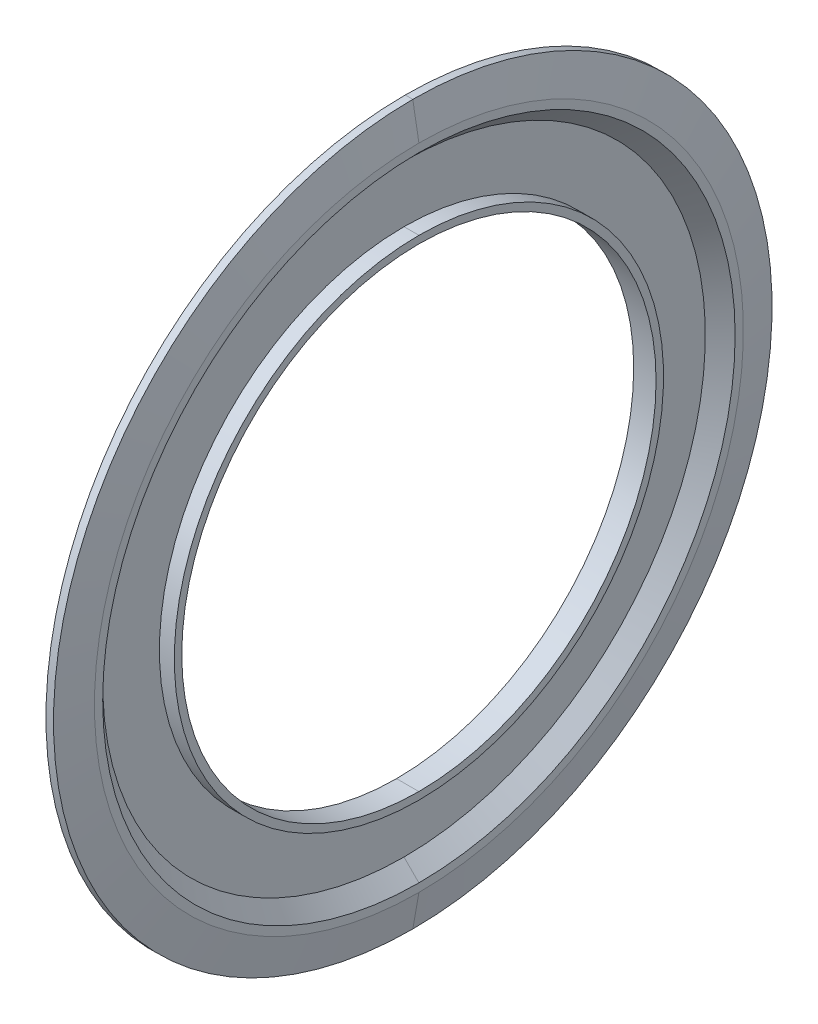
ISO-10303-21;
HEADER;
FILE_DESCRIPTION(('STEP AP214'),'2;1');
FILE_NAME('part.step','',(''),(''),'','','');
FILE_SCHEMA(('AUTOMOTIVE_DESIGN { 1 0 10303 214 1 1 1 1 }'));
ENDSEC;
DATA;
#1=APPLICATION_CONTEXT('core data for automotive mechanical design processes');
#2=APPLICATION_PROTOCOL_DEFINITION('international standard','automotive_design',2000,#1);
#3=PRODUCT_CONTEXT('',#1,'mechanical');
#4=PRODUCT('Part','Part','',(#3));
#5=PRODUCT_RELATED_PRODUCT_CATEGORY('part','',(#4));
#6=PRODUCT_DEFINITION_FORMATION('','',#4);
#7=PRODUCT_DEFINITION_CONTEXT('part definition',#1,'design');
#8=PRODUCT_DEFINITION('design','',#6,#7);
#9=PRODUCT_DEFINITION_SHAPE('','',#8);
#10=(LENGTH_UNIT() NAMED_UNIT(*) SI_UNIT(.MILLI.,.METRE.));
#11=(NAMED_UNIT(*) PLANE_ANGLE_UNIT() SI_UNIT($,.RADIAN.));
#12=(NAMED_UNIT(*) SI_UNIT($,.STERADIAN.) SOLID_ANGLE_UNIT());
#13=UNCERTAINTY_MEASURE_WITH_UNIT(LENGTH_MEASURE(1.E-05),#10,'distance_accuracy_value','');
#14=(GEOMETRIC_REPRESENTATION_CONTEXT(3) GLOBAL_UNCERTAINTY_ASSIGNED_CONTEXT((#13)) GLOBAL_UNIT_ASSIGNED_CONTEXT((#10,
#11,#12)) REPRESENTATION_CONTEXT('',''));
#15=CARTESIAN_POINT('',(0.,0.,0.));
#16=DIRECTION('',(0.,0.,1.));
#17=DIRECTION('',(1.,0.,0.));
#18=AXIS2_PLACEMENT_3D('',#15,#16,#17);
#19=CARTESIAN_POINT('',(0.727661870153498,7.996725,0.));
#20=DIRECTION('',(1.,0.,0.));
#21=DIRECTION('',(0.,0.,1.));
#22=AXIS2_PLACEMENT_3D('',#19,#20,#21);
#23=PLANE('',#22);
#24=CARTESIAN_POINT('',(0.727661870153498,0.,0.));
#25=DIRECTION('',(-1.,0.,0.));
#26=DIRECTION('',(0.,1.,0.));
#27=AXIS2_PLACEMENT_3D('',#24,#25,#26);
#28=CIRCLE('',#27,7.89345);
#29=CARTESIAN_POINT('',(0.727661870153498,7.89345,0.));
#30=VERTEX_POINT('',#29);
#31=CARTESIAN_POINT('',(0.727661870153498,-7.89345,0.));
#32=VERTEX_POINT('',#31);
#33=EDGE_CURVE('E11',#30,#32,#28,.T.);
#34=ORIENTED_EDGE('',*,*,#33,.T.);
#35=CARTESIAN_POINT('',(0.727661870153498,0.,0.));
#36=DIRECTION('',(-1.,0.,0.));
#37=DIRECTION('',(0.,1.,0.));
#38=AXIS2_PLACEMENT_3D('',#35,#36,#37);
#39=CIRCLE('',#38,7.89345);
#40=EDGE_CURVE('E110',#32,#30,#39,.T.);
#41=ORIENTED_EDGE('',*,*,#40,.T.);
#42=EDGE_LOOP('',(#34,#41));
#43=FACE_BOUND('',#42,.T.);
#44=CARTESIAN_POINT('',(0.727661870153498,0.,0.));
#45=DIRECTION('',(-1.,0.,0.));
#46=DIRECTION('',(0.,1.,0.));
#47=AXIS2_PLACEMENT_3D('',#44,#45,#46);
#48=CIRCLE('',#47,8.1);
#49=CARTESIAN_POINT('',(0.727661870153498,8.1,0.));
#50=VERTEX_POINT('',#49);
#51=CARTESIAN_POINT('',(0.727661870153498,-8.1,0.));
#52=VERTEX_POINT('',#51);
#53=EDGE_CURVE('E186',#50,#52,#48,.T.);
#54=ORIENTED_EDGE('',*,*,#53,.F.);
#55=CARTESIAN_POINT('',(0.727661870153498,0.,0.));
#56=DIRECTION('',(-1.,0.,0.));
#57=DIRECTION('',(0.,1.,0.));
#58=AXIS2_PLACEMENT_3D('',#55,#56,#57);
#59=CIRCLE('',#58,8.1);
#60=EDGE_CURVE('E30',#52,#50,#59,.T.);
#61=ORIENTED_EDGE('',*,*,#60,.F.);
#62=EDGE_LOOP('',(#54,#61));
#63=FACE_BOUND('',#62,.T.);
#64=ADVANCED_FACE('F17',(#43,#63),#23,.T.);
#65=CARTESIAN_POINT('',(0.541661870153498,0.,0.));
#66=DIRECTION('',(1.,0.,0.));
#67=DIRECTION('',(0.,1.,0.));
#68=AXIS2_PLACEMENT_3D('',#65,#66,#67);
#69=CONICAL_SURFACE('',#68,7.70745,0.785398163397448);
#70=DIRECTION('',(-0.707106781186548,-0.707106781186547,0.));
#71=VECTOR('',#70,1.);
#72=CARTESIAN_POINT('',(0.541661870153498,7.70745,0.));
#73=LINE('',#72,#71);
#74=CARTESIAN_POINT('',(0.355661870153497,7.52145,0.));
#75=VERTEX_POINT('',#74);
#76=EDGE_CURVE('E105',#30,#75,#73,.T.);
#77=ORIENTED_EDGE('',*,*,#76,.T.);
#78=CARTESIAN_POINT('',(0.355661870153497,0.,0.));
#79=DIRECTION('',(-1.,0.,0.));
#80=DIRECTION('',(0.,1.,0.));
#81=AXIS2_PLACEMENT_3D('',#78,#79,#80);
#82=CIRCLE('',#81,7.52145);
#83=CARTESIAN_POINT('',(0.355661870153497,-7.52145,0.));
#84=VERTEX_POINT('',#83);
#85=EDGE_CURVE('E24',#75,#84,#82,.T.);
#86=ORIENTED_EDGE('',*,*,#85,.T.);
#87=DIRECTION('',(0.707106781186548,-0.707106781186547,0.));
#88=VECTOR('',#87,1.);
#89=CARTESIAN_POINT('',(0.541661870153498,-7.70745,0.));
#90=LINE('',#89,#88);
#91=EDGE_CURVE('E107',#84,#32,#90,.T.);
#92=ORIENTED_EDGE('',*,*,#91,.T.);
#93=ORIENTED_EDGE('',*,*,#33,.F.);
#94=EDGE_LOOP('',(#77,#86,#92,#93));
#95=FACE_BOUND('',#94,.T.);
#96=ADVANCED_FACE('F103',(#95),#69,.F.);
#97=CARTESIAN_POINT('',(0.355661870153497,6.8136,0.));
#98=DIRECTION('',(1.,0.,0.));
#99=DIRECTION('',(0.,-1.,0.));
#100=AXIS2_PLACEMENT_3D('',#97,#98,#99);
#101=PLANE('',#100);
#102=CARTESIAN_POINT('',(0.355661870153497,0.,0.));
#103=DIRECTION('',(-1.,0.,0.));
#104=DIRECTION('',(0.,1.,0.));
#105=AXIS2_PLACEMENT_3D('',#102,#103,#104);
#106=CIRCLE('',#105,6.10575);
#107=CARTESIAN_POINT('',(0.355661870153497,6.10575,0.));
#108=VERTEX_POINT('',#107);
#109=CARTESIAN_POINT('',(0.355661870153497,-6.10575,0.));
#110=VERTEX_POINT('',#109);
#111=EDGE_CURVE('E147',#108,#110,#106,.T.);
#112=ORIENTED_EDGE('',*,*,#111,.T.);
#113=CARTESIAN_POINT('',(0.355661870153497,0.,0.));
#114=DIRECTION('',(-1.,0.,0.));
#115=DIRECTION('',(0.,1.,0.));
#116=AXIS2_PLACEMENT_3D('',#113,#114,#115);
#117=CIRCLE('',#116,6.10575);
#118=EDGE_CURVE('E202',#110,#108,#117,.T.);
#119=ORIENTED_EDGE('',*,*,#118,.T.);
#120=EDGE_LOOP('',(#112,#119));
#121=FACE_BOUND('',#120,.T.);
#122=ORIENTED_EDGE('',*,*,#85,.F.);
#123=CARTESIAN_POINT('',(0.355661870153497,0.,0.));
#124=DIRECTION('',(-1.,0.,0.));
#125=DIRECTION('',(0.,1.,0.));
#126=AXIS2_PLACEMENT_3D('',#123,#124,#125);
#127=CIRCLE('',#126,7.52145);
#128=EDGE_CURVE('E116',#84,#75,#127,.T.);
#129=ORIENTED_EDGE('',*,*,#128,.F.);
#130=EDGE_LOOP('',(#122,#129));
#131=FACE_BOUND('',#130,.T.);
#132=ADVANCED_FACE('F204',(#121,#131),#101,.T.);
#133=CARTESIAN_POINT('',(0.541661870153498,0.,0.));
#134=DIRECTION('',(-1.,0.,0.));
#135=DIRECTION('',(0.,1.,0.));
#136=AXIS2_PLACEMENT_3D('',#133,#134,#135);
#137=CYLINDRICAL_SURFACE('',#136,6.10575);
#138=DIRECTION('',(-1.,0.,0.));
#139=VECTOR('',#138,1.);
#140=CARTESIAN_POINT('',(0.541661870153498,6.10575,0.));
#141=LINE('',#140,#139);
#142=CARTESIAN_POINT('',(0.727661870153498,6.10575,0.));
#143=VERTEX_POINT('',#142);
#144=EDGE_CURVE('E133',#143,#108,#141,.T.);
#145=ORIENTED_EDGE('',*,*,#144,.T.);
#146=ORIENTED_EDGE('',*,*,#118,.F.);
#147=DIRECTION('',(1.,0.,0.));
#148=VECTOR('',#147,1.);
#149=CARTESIAN_POINT('',(0.541661870153498,-6.10575,0.));
#150=LINE('',#149,#148);
#151=CARTESIAN_POINT('',(0.727661870153498,-6.10575,0.));
#152=VERTEX_POINT('',#151);
#153=EDGE_CURVE('E139',#110,#152,#150,.T.);
#154=ORIENTED_EDGE('',*,*,#153,.T.);
#155=CARTESIAN_POINT('',(0.727661870153498,0.,0.));
#156=DIRECTION('',(-1.,0.,0.));
#157=DIRECTION('',(0.,1.,0.));
#158=AXIS2_PLACEMENT_3D('',#155,#156,#157);
#159=CIRCLE('',#158,6.10575);
#160=EDGE_CURVE('E200',#152,#143,#159,.T.);
#161=ORIENTED_EDGE('',*,*,#160,.T.);
#162=EDGE_LOOP('',(#145,#146,#154,#161));
#163=FACE_BOUND('',#162,.T.);
#164=ADVANCED_FACE('F206',(#163),#137,.T.);
#165=CARTESIAN_POINT('',(0.727661870153498,6.01275,0.));
#166=DIRECTION('',(1.,0.,0.));
#167=DIRECTION('',(0.,0.,1.));
#168=AXIS2_PLACEMENT_3D('',#165,#166,#167);
#169=PLANE('',#168);
#170=CARTESIAN_POINT('',(0.727661870153498,0.,0.));
#171=DIRECTION('',(-1.,0.,0.));
#172=DIRECTION('',(0.,1.,0.));
#173=AXIS2_PLACEMENT_3D('',#170,#171,#172);
#174=CIRCLE('',#173,5.91975);
#175=CARTESIAN_POINT('',(0.727661870153498,5.91975,0.));
#176=VERTEX_POINT('',#175);
#177=CARTESIAN_POINT('',(0.727661870153498,-5.91975,0.));
#178=VERTEX_POINT('',#177);
#179=EDGE_CURVE('E198',#176,#178,#174,.T.);
#180=ORIENTED_EDGE('',*,*,#179,.T.);
#181=CARTESIAN_POINT('',(0.727661870153498,0.,0.));
#182=DIRECTION('',(-1.,0.,0.));
#183=DIRECTION('',(0.,1.,0.));
#184=AXIS2_PLACEMENT_3D('',#181,#182,#183);
#185=CIRCLE('',#184,5.91975);
#186=EDGE_CURVE('E123',#178,#176,#185,.T.);
#187=ORIENTED_EDGE('',*,*,#186,.T.);
#188=EDGE_LOOP('',(#180,#187));
#189=FACE_BOUND('',#188,.T.);
#190=CARTESIAN_POINT('',(0.727661870153498,0.,0.));
#191=DIRECTION('',(-1.,0.,0.));
#192=DIRECTION('',(0.,1.,0.));
#193=AXIS2_PLACEMENT_3D('',#190,#191,#192);
#194=CIRCLE('',#193,6.10575);
#195=EDGE_CURVE('E136',#143,#152,#194,.T.);
#196=ORIENTED_EDGE('',*,*,#195,.F.);
#197=ORIENTED_EDGE('',*,*,#160,.F.);
#198=EDGE_LOOP('',(#196,#197));
#199=FACE_BOUND('',#198,.T.);
#200=ADVANCED_FACE('F214',(#189,#199),#169,.T.);
#201=CARTESIAN_POINT('',(0.448661870153497,0.,0.));
#202=DIRECTION('',(-1.,0.,0.));
#203=DIRECTION('',(0.,1.,0.));
#204=AXIS2_PLACEMENT_3D('',#201,#202,#203);
#205=CYLINDRICAL_SURFACE('',#204,5.91975);
#206=DIRECTION('',(-1.,0.,0.));
#207=VECTOR('',#206,1.);
#208=CARTESIAN_POINT('',(0.448661870153497,5.91975,0.));
#209=LINE('',#208,#207);
#210=CARTESIAN_POINT('',(0.169661870153497,5.91975,0.));
#211=VERTEX_POINT('',#210);
#212=EDGE_CURVE('E127',#176,#211,#209,.T.);
#213=ORIENTED_EDGE('',*,*,#212,.T.);
#214=CARTESIAN_POINT('',(0.169661870153497,0.,0.));
#215=DIRECTION('',(-1.,0.,0.));
#216=DIRECTION('',(0.,1.,0.));
#217=AXIS2_PLACEMENT_3D('',#214,#215,#216);
#218=CIRCLE('',#217,5.91975);
#219=CARTESIAN_POINT('',(0.169661870153497,-5.91975,0.));
#220=VERTEX_POINT('',#219);
#221=EDGE_CURVE('E120',#211,#220,#218,.T.);
#222=ORIENTED_EDGE('',*,*,#221,.T.);
#223=DIRECTION('',(1.,0.,0.));
#224=VECTOR('',#223,1.);
#225=CARTESIAN_POINT('',(0.448661870153497,-5.91975,0.));
#226=LINE('',#225,#224);
#227=EDGE_CURVE('E126',#220,#178,#226,.T.);
#228=ORIENTED_EDGE('',*,*,#227,.T.);
#229=ORIENTED_EDGE('',*,*,#179,.F.);
#230=EDGE_LOOP('',(#213,#222,#228,#229));
#231=FACE_BOUND('',#230,.T.);
#232=ADVANCED_FACE('F249',(#231),#205,.F.);
#233=CARTESIAN_POINT('',(0.169661870153497,6.7591218613007,0.));
#234=DIRECTION('',(-1.,0.,0.));
#235=DIRECTION('',(0.,0.,1.));
#236=AXIS2_PLACEMENT_3D('',#233,#234,#235);
#237=PLANE('',#236);
#238=ORIENTED_EDGE('',*,*,#221,.F.);
#239=CARTESIAN_POINT('',(0.169661870153497,0.,0.));
#240=DIRECTION('',(-1.,0.,0.));
#241=DIRECTION('',(0.,1.,0.));
#242=AXIS2_PLACEMENT_3D('',#239,#240,#241);
#243=CIRCLE('',#242,5.91975);
#244=EDGE_CURVE('E131',#220,#211,#243,.T.);
#245=ORIENTED_EDGE('',*,*,#244,.F.);
#246=EDGE_LOOP('',(#238,#245));
#247=FACE_BOUND('',#246,.T.);
#248=CARTESIAN_POINT('',(0.169661870153497,0.,0.));
#249=DIRECTION('',(-1.,0.,0.));
#250=DIRECTION('',(0.,1.,0.));
#251=AXIS2_PLACEMENT_3D('',#248,#249,#250);
#252=CIRCLE('',#251,7.5984937226014);
#253=CARTESIAN_POINT('',(0.169661870153497,7.5984937226014,0.));
#254=VERTEX_POINT('',#253);
#255=CARTESIAN_POINT('',(0.169661870153497,-7.5984937226014,0.));
#256=VERTEX_POINT('',#255);
#257=EDGE_CURVE('E150',#254,#256,#252,.T.);
#258=ORIENTED_EDGE('',*,*,#257,.T.);
#259=CARTESIAN_POINT('',(0.169661870153497,0.,0.));
#260=DIRECTION('',(-1.,0.,0.));
#261=DIRECTION('',(0.,1.,0.));
#262=AXIS2_PLACEMENT_3D('',#259,#260,#261);
#263=CIRCLE('',#262,7.5984937226014);
#264=EDGE_CURVE('E119',#256,#254,#263,.T.);
#265=ORIENTED_EDGE('',*,*,#264,.T.);
#266=EDGE_LOOP('',(#258,#265));
#267=FACE_BOUND('',#266,.T.);
#268=ADVANCED_FACE('F259',(#247,#267),#237,.T.);
#269=CARTESIAN_POINT('',(0.355661870153497,0.,0.));
#270=DIRECTION('',(1.,0.,0.));
#271=DIRECTION('',(0.,1.,0.));
#272=AXIS2_PLACEMENT_3D('',#269,#270,#271);
#273=CONICAL_SURFACE('',#272,7.7844937226014,0.785398163397447);
#274=DIRECTION('',(-0.707106781186549,-0.707106781186546,0.));
#275=VECTOR('',#274,1.);
#276=CARTESIAN_POINT('',(0.355661870153497,7.7844937226014,0.));
#277=LINE('',#276,#275);
#278=CARTESIAN_POINT('',(0.541661870153498,7.9704937226014,0.));
#279=VERTEX_POINT('',#278);
#280=EDGE_CURVE('E144',#279,#254,#277,.T.);
#281=ORIENTED_EDGE('',*,*,#280,.T.);
#282=ORIENTED_EDGE('',*,*,#264,.F.);
#283=DIRECTION('',(0.707106781186549,-0.707106781186546,0.));
#284=VECTOR('',#283,1.);
#285=CARTESIAN_POINT('',(0.355661870153497,-7.7844937226014,0.));
#286=LINE('',#285,#284);
#287=CARTESIAN_POINT('',(0.541661870153498,-7.9704937226014,0.));
#288=VERTEX_POINT('',#287);
#289=EDGE_CURVE('E143',#256,#288,#286,.T.);
#290=ORIENTED_EDGE('',*,*,#289,.T.);
#291=CARTESIAN_POINT('',(0.541661870153498,0.,0.));
#292=DIRECTION('',(-1.,0.,0.));
#293=DIRECTION('',(0.,1.,0.));
#294=AXIS2_PLACEMENT_3D('',#291,#292,#293);
#295=CIRCLE('',#294,7.9704937226014);
#296=EDGE_CURVE('E121',#288,#279,#295,.T.);
#297=ORIENTED_EDGE('',*,*,#296,.T.);
#298=EDGE_LOOP('',(#281,#282,#290,#297));
#299=FACE_BOUND('',#298,.T.);
#300=ADVANCED_FACE('F269',(#299),#273,.T.);
#301=CARTESIAN_POINT('',(0.541661870153498,8.02711041559279,0.));
#302=DIRECTION('',(-1.,0.,0.));
#303=DIRECTION('',(0.,0.,1.));
#304=AXIS2_PLACEMENT_3D('',#301,#302,#303);
#305=PLANE('',#304);
#306=CARTESIAN_POINT('',(0.541661870153498,0.,0.));
#307=DIRECTION('',(-1.,0.,0.));
#308=DIRECTION('',(0.,1.,0.));
#309=AXIS2_PLACEMENT_3D('',#306,#307,#308);
#310=CIRCLE('',#309,7.9704937226014);
#311=EDGE_CURVE('E140',#279,#288,#310,.T.);
#312=ORIENTED_EDGE('',*,*,#311,.F.);
#313=ORIENTED_EDGE('',*,*,#296,.F.);
#314=EDGE_LOOP('',(#312,#313));
#315=FACE_BOUND('',#314,.T.);
#316=CARTESIAN_POINT('',(0.541661870153498,0.,0.));
#317=DIRECTION('',(-1.,0.,0.));
#318=DIRECTION('',(0.,1.,0.));
#319=AXIS2_PLACEMENT_3D('',#316,#317,#318);
#320=CIRCLE('',#319,8.08372710858418);
#321=CARTESIAN_POINT('',(0.541661870153498,8.08372710858418,0.));
#322=VERTEX_POINT('',#321);
#323=CARTESIAN_POINT('',(0.541661870153498,-8.08372710858418,0.));
#324=VERTEX_POINT('',#323);
#325=EDGE_CURVE('E194',#322,#324,#320,.T.);
#326=ORIENTED_EDGE('',*,*,#325,.T.);
#327=CARTESIAN_POINT('',(0.541661870153498,0.,0.));
#328=DIRECTION('',(-1.,0.,0.));
#329=DIRECTION('',(0.,1.,0.));
#330=AXIS2_PLACEMENT_3D('',#327,#328,#329);
#331=CIRCLE('',#330,8.08372710858418);
#332=EDGE_CURVE('E164',#324,#322,#331,.T.);
#333=ORIENTED_EDGE('',*,*,#332,.T.);
#334=EDGE_LOOP('',(#326,#333));
#335=FACE_BOUND('',#334,.T.);
#336=ADVANCED_FACE('F279',(#315,#335),#305,.T.);
#337=CARTESIAN_POINT('',(0.463701285620649,0.,0.));
#338=DIRECTION('',(-1.,0.,0.));
#339=DIRECTION('',(0.,1.,0.));
#340=AXIS2_PLACEMENT_3D('',#337,#338,#339);
#341=CONICAL_SURFACE('',#340,8.52586355429209,1.39626340159546);
#342=DIRECTION('',(-0.173648177666931,0.984807753012208,0.));
#343=VECTOR('',#342,1.);
#344=CARTESIAN_POINT('',(0.463701285620649,8.52586355429209,0.));
#345=LINE('',#344,#343);
#346=CARTESIAN_POINT('',(0.385740701087801,8.968,0.));
#347=VERTEX_POINT('',#346);
#348=EDGE_CURVE('E161',#322,#347,#345,.T.);
#349=ORIENTED_EDGE('',*,*,#348,.T.);
#350=CARTESIAN_POINT('',(0.385740701087801,0.,0.));
#351=DIRECTION('',(-1.,0.,0.));
#352=DIRECTION('',(0.,1.,0.));
#353=AXIS2_PLACEMENT_3D('',#350,#351,#352);
#354=CIRCLE('',#353,8.968);
#355=CARTESIAN_POINT('',(0.385740701087801,-8.968,0.));
#356=VERTEX_POINT('',#355);
#357=EDGE_CURVE('E182',#347,#356,#354,.T.);
#358=ORIENTED_EDGE('',*,*,#357,.T.);
#359=DIRECTION('',(0.173648177666931,0.984807753012208,0.));
#360=VECTOR('',#359,1.);
#361=CARTESIAN_POINT('',(0.463701285620649,-8.52586355429209,0.));
#362=LINE('',#361,#360);
#363=EDGE_CURVE('E167',#356,#324,#362,.T.);
#364=ORIENTED_EDGE('',*,*,#363,.T.);
#365=ORIENTED_EDGE('',*,*,#325,.F.);
#366=EDGE_LOOP('',(#349,#358,#364,#365));
#367=FACE_BOUND('',#366,.T.);
#368=ADVANCED_FACE('F288',(#367),#341,.F.);
#369=CARTESIAN_POINT('',(0.480175375993175,0.,0.));
#370=DIRECTION('',(-1.,0.,0.));
#371=DIRECTION('',(0.,1.,0.));
#372=AXIS2_PLACEMENT_3D('',#369,#370,#371);
#373=CYLINDRICAL_SURFACE('',#372,8.968);
#374=DIRECTION('',(-1.,0.,0.));
#375=VECTOR('',#374,1.);
#376=CARTESIAN_POINT('',(0.480175375993175,8.968,0.));
#377=LINE('',#376,#375);
#378=CARTESIAN_POINT('',(0.57461005089855,8.968,0.));
#379=VERTEX_POINT('',#378);
#380=EDGE_CURVE('E173',#379,#347,#377,.T.);
#381=ORIENTED_EDGE('',*,*,#380,.T.);
#382=CARTESIAN_POINT('',(0.385740701087801,0.,0.));
#383=DIRECTION('',(-1.,0.,0.));
#384=DIRECTION('',(0.,1.,0.));
#385=AXIS2_PLACEMENT_3D('',#382,#383,#384);
#386=CIRCLE('',#385,8.968);
#387=EDGE_CURVE('E170',#356,#347,#386,.T.);
#388=ORIENTED_EDGE('',*,*,#387,.F.);
#389=DIRECTION('',(1.,0.,0.));
#390=VECTOR('',#389,1.);
#391=CARTESIAN_POINT('',(0.480175375993175,-8.968,0.));
#392=LINE('',#391,#390);
#393=CARTESIAN_POINT('',(0.57461005089855,-8.968,0.));
#394=VERTEX_POINT('',#393);
#395=EDGE_CURVE('E179',#356,#394,#392,.T.);
#396=ORIENTED_EDGE('',*,*,#395,.T.);
#397=CARTESIAN_POINT('',(0.57461005089855,0.,0.));
#398=DIRECTION('',(-1.,0.,0.));
#399=DIRECTION('',(0.,1.,0.));
#400=AXIS2_PLACEMENT_3D('',#397,#398,#399);
#401=CIRCLE('',#400,8.968);
#402=EDGE_CURVE('E191',#394,#379,#401,.T.);
#403=ORIENTED_EDGE('',*,*,#402,.T.);
#404=EDGE_LOOP('',(#381,#388,#396,#403));
#405=FACE_BOUND('',#404,.T.);
#406=ADVANCED_FACE('F298',(#405),#373,.T.);
#407=CARTESIAN_POINT('',(0.651135960526024,0.,0.));
#408=DIRECTION('',(-1.,0.,0.));
#409=DIRECTION('',(0.,1.,0.));
#410=AXIS2_PLACEMENT_3D('',#407,#408,#409);
#411=CONICAL_SURFACE('',#410,8.534,1.39626340159546);
#412=DIRECTION('',(-0.17364817766693,0.984807753012208,0.));
#413=VECTOR('',#412,1.);
#414=CARTESIAN_POINT('',(0.651135960526024,8.534,0.));
#415=LINE('',#414,#413);
#416=EDGE_CURVE('E184',#50,#379,#415,.T.);
#417=ORIENTED_EDGE('',*,*,#416,.T.);
#418=ORIENTED_EDGE('',*,*,#402,.F.);
#419=DIRECTION('',(0.17364817766693,0.984807753012208,0.));
#420=VECTOR('',#419,1.);
#421=CARTESIAN_POINT('',(0.651135960526024,-8.534,0.));
#422=LINE('',#421,#420);
#423=EDGE_CURVE('E189',#394,#52,#422,.T.);
#424=ORIENTED_EDGE('',*,*,#423,.T.);
#425=ORIENTED_EDGE('',*,*,#60,.T.);
#426=EDGE_LOOP('',(#417,#418,#424,#425));
#427=FACE_BOUND('',#426,.T.);
#428=ADVANCED_FACE('F308',(#427),#411,.T.);
#429=CARTESIAN_POINT('',(0.651135960526024,0.,0.));
#430=DIRECTION('',(-1.,0.,0.));
#431=DIRECTION('',(0.,1.,0.));
#432=AXIS2_PLACEMENT_3D('',#429,#430,#431);
#433=CONICAL_SURFACE('',#432,8.534,1.39626340159546);
#434=ORIENTED_EDGE('',*,*,#416,.F.);
#435=ORIENTED_EDGE('',*,*,#53,.T.);
#436=ORIENTED_EDGE('',*,*,#423,.F.);
#437=CARTESIAN_POINT('',(0.57461005089855,0.,0.));
#438=DIRECTION('',(-1.,0.,0.));
#439=DIRECTION('',(0.,1.,0.));
#440=AXIS2_PLACEMENT_3D('',#437,#438,#439);
#441=CIRCLE('',#440,8.968);
#442=EDGE_CURVE('E176',#379,#394,#441,.T.);
#443=ORIENTED_EDGE('',*,*,#442,.F.);
#444=EDGE_LOOP('',(#434,#435,#436,#443));
#445=FACE_BOUND('',#444,.T.);
#446=ADVANCED_FACE('F318',(#445),#433,.T.);
#447=CARTESIAN_POINT('',(0.480175375993175,0.,0.));
#448=DIRECTION('',(-1.,0.,0.));
#449=DIRECTION('',(0.,1.,0.));
#450=AXIS2_PLACEMENT_3D('',#447,#448,#449);
#451=CYLINDRICAL_SURFACE('',#450,8.968);
#452=ORIENTED_EDGE('',*,*,#380,.F.);
#453=ORIENTED_EDGE('',*,*,#442,.T.);
#454=ORIENTED_EDGE('',*,*,#395,.F.);
#455=ORIENTED_EDGE('',*,*,#357,.F.);
#456=EDGE_LOOP('',(#452,#453,#454,#455));
#457=FACE_BOUND('',#456,.T.);
#458=ADVANCED_FACE('F327',(#457),#451,.T.);
#459=CARTESIAN_POINT('',(0.463701285620649,0.,0.));
#460=DIRECTION('',(-1.,0.,0.));
#461=DIRECTION('',(0.,1.,0.));
#462=AXIS2_PLACEMENT_3D('',#459,#460,#461);
#463=CONICAL_SURFACE('',#462,8.52586355429209,1.39626340159546);
#464=ORIENTED_EDGE('',*,*,#348,.F.);
#465=ORIENTED_EDGE('',*,*,#332,.F.);
#466=ORIENTED_EDGE('',*,*,#363,.F.);
#467=ORIENTED_EDGE('',*,*,#387,.T.);
#468=EDGE_LOOP('',(#464,#465,#466,#467));
#469=FACE_BOUND('',#468,.T.);
#470=ADVANCED_FACE('F337',(#469),#463,.F.);
#471=CARTESIAN_POINT('',(0.355661870153497,0.,0.));
#472=DIRECTION('',(1.,0.,0.));
#473=DIRECTION('',(0.,1.,0.));
#474=AXIS2_PLACEMENT_3D('',#471,#472,#473);
#475=CONICAL_SURFACE('',#474,7.7844937226014,0.785398163397447);
#476=ORIENTED_EDGE('',*,*,#280,.F.);
#477=ORIENTED_EDGE('',*,*,#311,.T.);
#478=ORIENTED_EDGE('',*,*,#289,.F.);
#479=ORIENTED_EDGE('',*,*,#257,.F.);
#480=EDGE_LOOP('',(#476,#477,#478,#479));
#481=FACE_BOUND('',#480,.T.);
#482=ADVANCED_FACE('F347',(#481),#475,.T.);
#483=CARTESIAN_POINT('',(0.448661870153497,0.,0.));
#484=DIRECTION('',(-1.,0.,0.));
#485=DIRECTION('',(0.,1.,0.));
#486=AXIS2_PLACEMENT_3D('',#483,#484,#485);
#487=CYLINDRICAL_SURFACE('',#486,5.91975);
#488=ORIENTED_EDGE('',*,*,#212,.F.);
#489=ORIENTED_EDGE('',*,*,#186,.F.);
#490=ORIENTED_EDGE('',*,*,#227,.F.);
#491=ORIENTED_EDGE('',*,*,#244,.T.);
#492=EDGE_LOOP('',(#488,#489,#490,#491));
#493=FACE_BOUND('',#492,.T.);
#494=ADVANCED_FACE('F357',(#493),#487,.F.);
#495=CARTESIAN_POINT('',(0.541661870153498,0.,0.));
#496=DIRECTION('',(-1.,0.,0.));
#497=DIRECTION('',(0.,1.,0.));
#498=AXIS2_PLACEMENT_3D('',#495,#496,#497);
#499=CYLINDRICAL_SURFACE('',#498,6.10575);
#500=ORIENTED_EDGE('',*,*,#144,.F.);
#501=ORIENTED_EDGE('',*,*,#195,.T.);
#502=ORIENTED_EDGE('',*,*,#153,.F.);
#503=ORIENTED_EDGE('',*,*,#111,.F.);
#504=EDGE_LOOP('',(#500,#501,#502,#503));
#505=FACE_BOUND('',#504,.T.);
#506=ADVANCED_FACE('F367',(#505),#499,.T.);
#507=CARTESIAN_POINT('',(0.541661870153498,0.,0.));
#508=DIRECTION('',(1.,0.,0.));
#509=DIRECTION('',(0.,1.,0.));
#510=AXIS2_PLACEMENT_3D('',#507,#508,#509);
#511=CONICAL_SURFACE('',#510,7.70745,0.785398163397448);
#512=ORIENTED_EDGE('',*,*,#76,.F.);
#513=ORIENTED_EDGE('',*,*,#40,.F.);
#514=ORIENTED_EDGE('',*,*,#91,.F.);
#515=ORIENTED_EDGE('',*,*,#128,.T.);
#516=EDGE_LOOP('',(#512,#513,#514,#515));
#517=FACE_BOUND('',#516,.T.);
#518=ADVANCED_FACE('F114',(#517),#511,.F.);
#519=CLOSED_SHELL('',(#64,#96,#132,#164,#200,#232,#268,#300,#336,#368,#406,#428,#446,#458,#470,
#482,#494,#506,#518));
#520=MANIFOLD_SOLID_BREP('B1',#519);
#521=ADVANCED_BREP_SHAPE_REPRESENTATION('',(#18,#520),#14);
#522=SHAPE_DEFINITION_REPRESENTATION(#9,#521);
ENDSEC;
END-ISO-10303-21;
